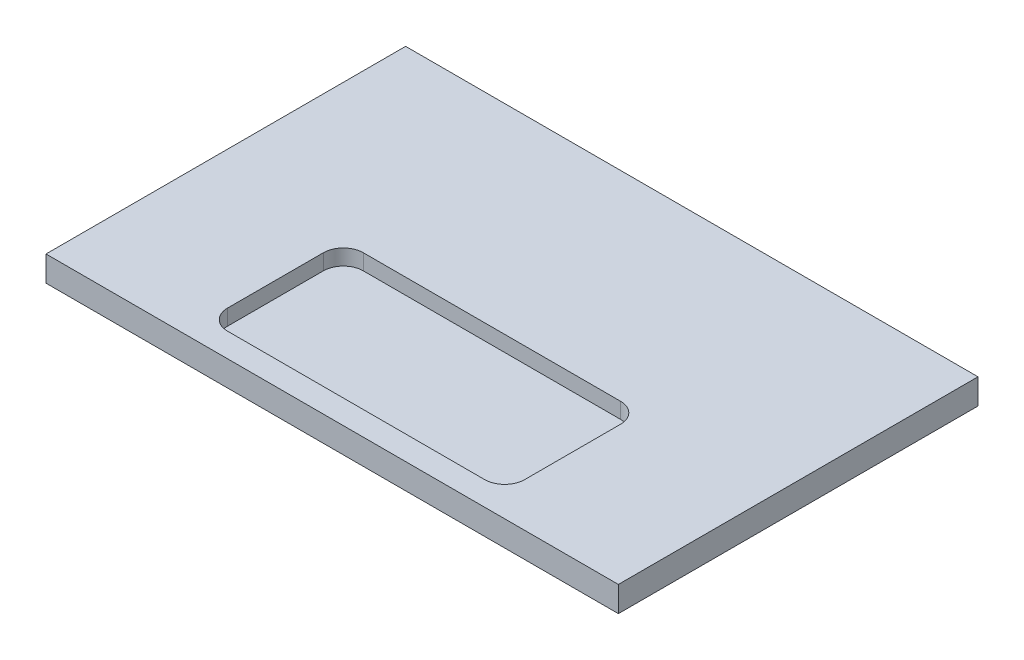
ISO-10303-21;
HEADER;
FILE_DESCRIPTION(('STEP AP214'),'2;1');
FILE_NAME('part.step','',(''),(''),'','','');
FILE_SCHEMA(('AUTOMOTIVE_DESIGN { 1 0 10303 214 1 1 1 1 }'));
ENDSEC;
DATA;
#1=APPLICATION_CONTEXT('core data for automotive mechanical design processes');
#2=APPLICATION_PROTOCOL_DEFINITION('international standard','automotive_design',2000,#1);
#3=PRODUCT_CONTEXT('',#1,'mechanical');
#4=PRODUCT('Part','Part','',(#3));
#5=PRODUCT_RELATED_PRODUCT_CATEGORY('part','',(#4));
#6=PRODUCT_DEFINITION_FORMATION('','',#4);
#7=PRODUCT_DEFINITION_CONTEXT('part definition',#1,'design');
#8=PRODUCT_DEFINITION('design','',#6,#7);
#9=PRODUCT_DEFINITION_SHAPE('','',#8);
#10=(LENGTH_UNIT() NAMED_UNIT(*) SI_UNIT(.MILLI.,.METRE.));
#11=(NAMED_UNIT(*) PLANE_ANGLE_UNIT() SI_UNIT($,.RADIAN.));
#12=(NAMED_UNIT(*) SI_UNIT($,.STERADIAN.) SOLID_ANGLE_UNIT());
#13=UNCERTAINTY_MEASURE_WITH_UNIT(LENGTH_MEASURE(1.E-05),#10,'distance_accuracy_value','');
#14=(GEOMETRIC_REPRESENTATION_CONTEXT(3) GLOBAL_UNCERTAINTY_ASSIGNED_CONTEXT((#13)) GLOBAL_UNIT_ASSIGNED_CONTEXT((#10,
#11,#12)) REPRESENTATION_CONTEXT('',''));
#15=CARTESIAN_POINT('',(0.,0.,0.));
#16=DIRECTION('',(0.,0.,1.));
#17=DIRECTION('',(1.,0.,0.));
#18=AXIS2_PLACEMENT_3D('',#15,#16,#17);
#19=CARTESIAN_POINT('',(-192.196752827141,12.7,168.516074313409));
#20=DIRECTION('',(1.,0.,0.));
#21=DIRECTION('',(0.,0.,-1.));
#22=AXIS2_PLACEMENT_3D('',#19,#20,#21);
#23=PLANE('',#22);
#24=DIRECTION('',(0.,0.,1.));
#25=VECTOR('',#24,1.);
#26=CARTESIAN_POINT('',(-192.196752827141,0.,168.516074313409));
#27=LINE('',#26,#25);
#28=CARTESIAN_POINT('',(-192.196752827141,0.,-11.8239256865913));
#29=VERTEX_POINT('',#28);
#30=CARTESIAN_POINT('',(-192.196752827141,0.,168.516074313409));
#31=VERTEX_POINT('',#30);
#32=EDGE_CURVE('E143',#29,#31,#27,.T.);
#33=ORIENTED_EDGE('',*,*,#32,.T.);
#34=DIRECTION('',(0.,-1.,0.));
#35=VECTOR('',#34,1.);
#36=CARTESIAN_POINT('',(-192.196752827141,12.7,168.516074313409));
#37=LINE('',#36,#35);
#38=CARTESIAN_POINT('',(-192.196752827141,12.7,168.516074313409));
#39=VERTEX_POINT('',#38);
#40=EDGE_CURVE('E124',#39,#31,#37,.T.);
#41=ORIENTED_EDGE('',*,*,#40,.F.);
#42=DIRECTION('',(0.,0.,1.));
#43=VECTOR('',#42,1.);
#44=CARTESIAN_POINT('',(-192.196752827141,12.7,168.516074313409));
#45=LINE('',#44,#43);
#46=CARTESIAN_POINT('',(-192.196752827141,12.7,-11.8239256865913));
#47=VERTEX_POINT('',#46);
#48=EDGE_CURVE('E131',#47,#39,#45,.T.);
#49=ORIENTED_EDGE('',*,*,#48,.F.);
#50=DIRECTION('',(0.,-1.,0.));
#51=VECTOR('',#50,1.);
#52=CARTESIAN_POINT('',(-192.196752827141,12.7,-11.8239256865913));
#53=LINE('',#52,#51);
#54=EDGE_CURVE('E222',#47,#29,#53,.T.);
#55=ORIENTED_EDGE('',*,*,#54,.T.);
#56=EDGE_LOOP('',(#33,#41,#49,#55));
#57=FACE_BOUND('',#56,.T.);
#58=ADVANCED_FACE('F32',(#57),#23,.F.);
#59=CARTESIAN_POINT('',(94.8232471728595,12.7,168.516074313409));
#60=DIRECTION('',(0.,0.,-1.));
#61=DIRECTION('',(-1.,0.,0.));
#62=AXIS2_PLACEMENT_3D('',#59,#60,#61);
#63=PLANE('',#62);
#64=DIRECTION('',(1.,0.,0.));
#65=VECTOR('',#64,1.);
#66=CARTESIAN_POINT('',(94.8232471728595,0.,168.516074313409));
#67=LINE('',#66,#65);
#68=CARTESIAN_POINT('',(94.8232471728595,0.,168.516074313409));
#69=VERTEX_POINT('',#68);
#70=EDGE_CURVE('E224',#31,#69,#67,.T.);
#71=ORIENTED_EDGE('',*,*,#70,.T.);
#72=DIRECTION('',(0.,-1.,0.));
#73=VECTOR('',#72,1.);
#74=CARTESIAN_POINT('',(94.8232471728595,12.7,168.516074313409));
#75=LINE('',#74,#73);
#76=CARTESIAN_POINT('',(94.8232471728595,12.7,168.516074313409));
#77=VERTEX_POINT('',#76);
#78=EDGE_CURVE('E127',#77,#69,#75,.T.);
#79=ORIENTED_EDGE('',*,*,#78,.F.);
#80=DIRECTION('',(1.,0.,0.));
#81=VECTOR('',#80,1.);
#82=CARTESIAN_POINT('',(94.8232471728595,12.7,168.516074313409));
#83=LINE('',#82,#81);
#84=EDGE_CURVE('E120',#39,#77,#83,.T.);
#85=ORIENTED_EDGE('',*,*,#84,.F.);
#86=ORIENTED_EDGE('',*,*,#40,.T.);
#87=EDGE_LOOP('',(#71,#79,#85,#86));
#88=FACE_BOUND('',#87,.T.);
#89=ADVANCED_FACE('F122',(#88),#63,.F.);
#90=CARTESIAN_POINT('',(94.8232471728595,12.7,-11.8239256865913));
#91=DIRECTION('',(-1.,0.,0.));
#92=DIRECTION('',(0.,0.,1.));
#93=AXIS2_PLACEMENT_3D('',#90,#91,#92);
#94=PLANE('',#93);
#95=DIRECTION('',(0.,0.,-1.));
#96=VECTOR('',#95,1.);
#97=CARTESIAN_POINT('',(94.8232471728595,0.,-11.8239256865913));
#98=LINE('',#97,#96);
#99=CARTESIAN_POINT('',(94.8232471728595,0.,-11.8239256865913));
#100=VERTEX_POINT('',#99);
#101=EDGE_CURVE('E226',#69,#100,#98,.T.);
#102=ORIENTED_EDGE('',*,*,#101,.T.);
#103=DIRECTION('',(0.,-1.,0.));
#104=VECTOR('',#103,1.);
#105=CARTESIAN_POINT('',(94.8232471728595,12.7,-11.8239256865913));
#106=LINE('',#105,#104);
#107=CARTESIAN_POINT('',(94.8232471728595,12.7,-11.8239256865913));
#108=VERTEX_POINT('',#107);
#109=EDGE_CURVE('E148',#108,#100,#106,.T.);
#110=ORIENTED_EDGE('',*,*,#109,.F.);
#111=DIRECTION('',(0.,0.,-1.));
#112=VECTOR('',#111,1.);
#113=CARTESIAN_POINT('',(94.8232471728595,12.7,-11.8239256865913));
#114=LINE('',#113,#112);
#115=EDGE_CURVE('E130',#77,#108,#114,.T.);
#116=ORIENTED_EDGE('',*,*,#115,.F.);
#117=ORIENTED_EDGE('',*,*,#78,.T.);
#118=EDGE_LOOP('',(#102,#110,#116,#117));
#119=FACE_BOUND('',#118,.T.);
#120=ADVANCED_FACE('F238',(#119),#94,.F.);
#121=CARTESIAN_POINT('',(-192.196752827141,12.7,-11.8239256865913));
#122=DIRECTION('',(0.,0.,1.));
#123=DIRECTION('',(1.,0.,0.));
#124=AXIS2_PLACEMENT_3D('',#121,#122,#123);
#125=PLANE('',#124);
#126=DIRECTION('',(-1.,0.,0.));
#127=VECTOR('',#126,1.);
#128=CARTESIAN_POINT('',(-192.196752827141,0.,-11.8239256865913));
#129=LINE('',#128,#127);
#130=EDGE_CURVE('E140',#100,#29,#129,.T.);
#131=ORIENTED_EDGE('',*,*,#130,.T.);
#132=ORIENTED_EDGE('',*,*,#54,.F.);
#133=DIRECTION('',(-1.,0.,0.));
#134=VECTOR('',#133,1.);
#135=CARTESIAN_POINT('',(-192.196752827141,12.7,-11.8239256865913));
#136=LINE('',#135,#134);
#137=EDGE_CURVE('E136',#108,#47,#136,.T.);
#138=ORIENTED_EDGE('',*,*,#137,.F.);
#139=ORIENTED_EDGE('',*,*,#109,.T.);
#140=EDGE_LOOP('',(#131,#132,#138,#139));
#141=FACE_BOUND('',#140,.T.);
#142=ADVANCED_FACE('F233',(#141),#125,.F.);
#143=CARTESIAN_POINT('',(0.,12.7,0.));
#144=DIRECTION('',(0.,-1.,0.));
#145=DIRECTION('',(0.,0.,-1.));
#146=AXIS2_PLACEMENT_3D('',#143,#144,#145);
#147=PLANE('',#146);
#148=DIRECTION('',(0.,0.,-1.));
#149=VECTOR('',#148,1.);
#150=CARTESIAN_POINT('',(25.8132471728595,12.7,88.4160743134087));
#151=LINE('',#150,#149);
#152=CARTESIAN_POINT('',(25.8132471728595,12.7,146.516074313409));
#153=VERTEX_POINT('',#152);
#154=CARTESIAN_POINT('',(25.8132471728595,12.7,98.4160743134087));
#155=VERTEX_POINT('',#154);
#156=EDGE_CURVE('E182',#153,#155,#151,.T.);
#157=ORIENTED_EDGE('',*,*,#156,.F.);
#158=CARTESIAN_POINT('',(15.8132471728595,12.7,146.516074313409));
#159=DIRECTION('',(0.,-1.,0.));
#160=DIRECTION('',(0.,0.,-1.));
#161=AXIS2_PLACEMENT_3D('',#158,#159,#160);
#162=CIRCLE('',#161,10.);
#163=CARTESIAN_POINT('',(15.8132471728595,12.7,156.516074313409));
#164=VERTEX_POINT('',#163);
#165=EDGE_CURVE('E176',#153,#164,#162,.T.);
#166=ORIENTED_EDGE('',*,*,#165,.T.);
#167=DIRECTION('',(1.,0.,0.));
#168=VECTOR('',#167,1.);
#169=CARTESIAN_POINT('',(25.8132471728595,12.7,156.516074313409));
#170=LINE('',#169,#168);
#171=CARTESIAN_POINT('',(-113.186752827141,12.7,156.516074313409));
#172=VERTEX_POINT('',#171);
#173=EDGE_CURVE('E193',#172,#164,#170,.T.);
#174=ORIENTED_EDGE('',*,*,#173,.F.);
#175=CARTESIAN_POINT('',(-113.186752827141,12.7,146.516074313409));
#176=DIRECTION('',(0.,-1.,0.));
#177=DIRECTION('',(0.,0.,-1.));
#178=AXIS2_PLACEMENT_3D('',#175,#176,#177);
#179=CIRCLE('',#178,10.);
#180=CARTESIAN_POINT('',(-123.186752827141,12.7,146.516074313409));
#181=VERTEX_POINT('',#180);
#182=EDGE_CURVE('E40',#172,#181,#179,.T.);
#183=ORIENTED_EDGE('',*,*,#182,.T.);
#184=DIRECTION('',(0.,0.,1.));
#185=VECTOR('',#184,1.);
#186=CARTESIAN_POINT('',(-123.186752827141,12.7,156.516074313409));
#187=LINE('',#186,#185);
#188=CARTESIAN_POINT('',(-123.186752827141,12.7,98.4160743134087));
#189=VERTEX_POINT('',#188);
#190=EDGE_CURVE('E218',#189,#181,#187,.T.);
#191=ORIENTED_EDGE('',*,*,#190,.F.);
#192=CARTESIAN_POINT('',(-113.186752827141,12.7,98.4160743134087));
#193=DIRECTION('',(0.,-1.,0.));
#194=DIRECTION('',(0.,0.,-1.));
#195=AXIS2_PLACEMENT_3D('',#192,#193,#194);
#196=CIRCLE('',#195,10.);
#197=CARTESIAN_POINT('',(-113.186752827141,12.7,88.4160743134088));
#198=VERTEX_POINT('',#197);
#199=EDGE_CURVE('E11',#189,#198,#196,.T.);
#200=ORIENTED_EDGE('',*,*,#199,.T.);
#201=DIRECTION('',(-1.,0.,0.));
#202=VECTOR('',#201,1.);
#203=CARTESIAN_POINT('',(-123.186752827141,12.7,88.4160743134088));
#204=LINE('',#203,#202);
#205=CARTESIAN_POINT('',(15.8132471728595,12.7,88.4160743134087));
#206=VERTEX_POINT('',#205);
#207=EDGE_CURVE('E184',#206,#198,#204,.T.);
#208=ORIENTED_EDGE('',*,*,#207,.F.);
#209=CARTESIAN_POINT('',(15.8132471728595,12.7,98.4160743134087));
#210=DIRECTION('',(0.,-1.,0.));
#211=DIRECTION('',(0.,0.,-1.));
#212=AXIS2_PLACEMENT_3D('',#209,#210,#211);
#213=CIRCLE('',#212,10.);
#214=EDGE_CURVE('E178',#206,#155,#213,.T.);
#215=ORIENTED_EDGE('',*,*,#214,.T.);
#216=EDGE_LOOP('',(#157,#166,#174,#183,#191,#200,#208,#215));
#217=FACE_BOUND('',#216,.T.);
#218=ORIENTED_EDGE('',*,*,#48,.T.);
#219=ORIENTED_EDGE('',*,*,#84,.T.);
#220=ORIENTED_EDGE('',*,*,#115,.T.);
#221=ORIENTED_EDGE('',*,*,#137,.T.);
#222=EDGE_LOOP('',(#218,#219,#220,#221));
#223=FACE_BOUND('',#222,.T.);
#224=ADVANCED_FACE('F134',(#217,#223),#147,.F.);
#225=CARTESIAN_POINT('',(0.,0.,0.));
#226=DIRECTION('',(0.,-1.,0.));
#227=DIRECTION('',(0.,0.,-1.));
#228=AXIS2_PLACEMENT_3D('',#225,#226,#227);
#229=PLANE('',#228);
#230=ORIENTED_EDGE('',*,*,#32,.F.);
#231=ORIENTED_EDGE('',*,*,#130,.F.);
#232=ORIENTED_EDGE('',*,*,#101,.F.);
#233=ORIENTED_EDGE('',*,*,#70,.F.);
#234=EDGE_LOOP('',(#230,#231,#232,#233));
#235=FACE_BOUND('',#234,.T.);
#236=ADVANCED_FACE('F237',(#235),#229,.T.);
#237=CARTESIAN_POINT('',(25.8132471728595,4.826,156.516074313409));
#238=DIRECTION('',(0.,0.,1.));
#239=DIRECTION('',(1.,0.,0.));
#240=AXIS2_PLACEMENT_3D('',#237,#238,#239);
#241=PLANE('',#240);
#242=ORIENTED_EDGE('',*,*,#173,.T.);
#243=DIRECTION('',(0.,1.,0.));
#244=VECTOR('',#243,1.);
#245=CARTESIAN_POINT('',(15.8132471728595,4.826,156.516074313409));
#246=LINE('',#245,#244);
#247=CARTESIAN_POINT('',(15.8132471728595,4.826,156.516074313409));
#248=VERTEX_POINT('',#247);
#249=EDGE_CURVE('E157',#164,#248,#246,.F.);
#250=ORIENTED_EDGE('',*,*,#249,.T.);
#251=DIRECTION('',(1.,0.,0.));
#252=VECTOR('',#251,1.);
#253=CARTESIAN_POINT('',(25.8132471728595,4.826,156.516074313409));
#254=LINE('',#253,#252);
#255=CARTESIAN_POINT('',(-113.186752827141,4.826,156.516074313409));
#256=VERTEX_POINT('',#255);
#257=EDGE_CURVE('E211',#256,#248,#254,.T.);
#258=ORIENTED_EDGE('',*,*,#257,.F.);
#259=DIRECTION('',(0.,1.,0.));
#260=VECTOR('',#259,1.);
#261=CARTESIAN_POINT('',(-113.186752827141,12.7,156.516074313409));
#262=LINE('',#261,#260);
#263=EDGE_CURVE('E154',#256,#172,#262,.T.);
#264=ORIENTED_EDGE('',*,*,#263,.T.);
#265=EDGE_LOOP('',(#242,#250,#258,#264));
#266=FACE_BOUND('',#265,.T.);
#267=ADVANCED_FACE('F270',(#266),#241,.F.);
#268=CARTESIAN_POINT('',(-123.186752827141,4.826,156.516074313409));
#269=DIRECTION('',(-1.,0.,0.));
#270=DIRECTION('',(0.,0.,1.));
#271=AXIS2_PLACEMENT_3D('',#268,#269,#270);
#272=PLANE('',#271);
#273=ORIENTED_EDGE('',*,*,#190,.T.);
#274=DIRECTION('',(0.,1.,0.));
#275=VECTOR('',#274,1.);
#276=CARTESIAN_POINT('',(-123.186752827141,4.826,146.516074313409));
#277=LINE('',#276,#275);
#278=CARTESIAN_POINT('',(-123.186752827141,4.826,146.516074313409));
#279=VERTEX_POINT('',#278);
#280=EDGE_CURVE('E174',#181,#279,#277,.F.);
#281=ORIENTED_EDGE('',*,*,#280,.T.);
#282=DIRECTION('',(0.,0.,1.));
#283=VECTOR('',#282,1.);
#284=CARTESIAN_POINT('',(-123.186752827141,4.826,156.516074313409));
#285=LINE('',#284,#283);
#286=CARTESIAN_POINT('',(-123.186752827141,4.826,98.4160743134087));
#287=VERTEX_POINT('',#286);
#288=EDGE_CURVE('E207',#287,#279,#285,.T.);
#289=ORIENTED_EDGE('',*,*,#288,.F.);
#290=DIRECTION('',(0.,1.,0.));
#291=VECTOR('',#290,1.);
#292=CARTESIAN_POINT('',(-123.186752827141,12.7,98.4160743134087));
#293=LINE('',#292,#291);
#294=EDGE_CURVE('E172',#287,#189,#293,.T.);
#295=ORIENTED_EDGE('',*,*,#294,.T.);
#296=EDGE_LOOP('',(#273,#281,#289,#295));
#297=FACE_BOUND('',#296,.T.);
#298=ADVANCED_FACE('F273',(#297),#272,.F.);
#299=CARTESIAN_POINT('',(-123.186752827141,4.826,88.4160743134088));
#300=DIRECTION('',(0.,0.,-1.));
#301=DIRECTION('',(-1.,0.,0.));
#302=AXIS2_PLACEMENT_3D('',#299,#300,#301);
#303=PLANE('',#302);
#304=DIRECTION('',(-1.,0.,0.));
#305=VECTOR('',#304,1.);
#306=CARTESIAN_POINT('',(-123.186752827141,4.826,88.4160743134088));
#307=LINE('',#306,#305);
#308=CARTESIAN_POINT('',(15.8132471728595,4.826,88.4160743134087));
#309=VERTEX_POINT('',#308);
#310=CARTESIAN_POINT('',(-113.186752827141,4.826,88.4160743134088));
#311=VERTEX_POINT('',#310);
#312=EDGE_CURVE('E202',#309,#311,#307,.T.);
#313=ORIENTED_EDGE('',*,*,#312,.F.);
#314=DIRECTION('',(0.,1.,0.));
#315=VECTOR('',#314,1.);
#316=CARTESIAN_POINT('',(15.8132471728595,12.7,88.4160743134087));
#317=LINE('',#316,#315);
#318=EDGE_CURVE('E169',#309,#206,#317,.T.);
#319=ORIENTED_EDGE('',*,*,#318,.T.);
#320=ORIENTED_EDGE('',*,*,#207,.T.);
#321=DIRECTION('',(0.,1.,0.));
#322=VECTOR('',#321,1.);
#323=CARTESIAN_POINT('',(-113.186752827141,4.826,88.4160743134088));
#324=LINE('',#323,#322);
#325=EDGE_CURVE('E167',#198,#311,#324,.F.);
#326=ORIENTED_EDGE('',*,*,#325,.T.);
#327=EDGE_LOOP('',(#313,#319,#320,#326));
#328=FACE_BOUND('',#327,.T.);
#329=ADVANCED_FACE('F206',(#328),#303,.F.);
#330=CARTESIAN_POINT('',(25.8132471728595,4.826,88.4160743134087));
#331=DIRECTION('',(1.,0.,0.));
#332=DIRECTION('',(0.,0.,-1.));
#333=AXIS2_PLACEMENT_3D('',#330,#331,#332);
#334=PLANE('',#333);
#335=DIRECTION('',(0.,0.,-1.));
#336=VECTOR('',#335,1.);
#337=CARTESIAN_POINT('',(25.8132471728595,4.826,88.4160743134087));
#338=LINE('',#337,#336);
#339=CARTESIAN_POINT('',(25.8132471728595,4.826,146.516074313409));
#340=VERTEX_POINT('',#339);
#341=CARTESIAN_POINT('',(25.8132471728595,4.826,98.4160743134087));
#342=VERTEX_POINT('',#341);
#343=EDGE_CURVE('E204',#340,#342,#338,.T.);
#344=ORIENTED_EDGE('',*,*,#343,.F.);
#345=DIRECTION('',(0.,1.,0.));
#346=VECTOR('',#345,1.);
#347=CARTESIAN_POINT('',(25.8132471728595,12.7,146.516074313409));
#348=LINE('',#347,#346);
#349=EDGE_CURVE('E146',#340,#153,#348,.T.);
#350=ORIENTED_EDGE('',*,*,#349,.T.);
#351=ORIENTED_EDGE('',*,*,#156,.T.);
#352=DIRECTION('',(0.,1.,0.));
#353=VECTOR('',#352,1.);
#354=CARTESIAN_POINT('',(25.8132471728595,4.826,98.4160743134087));
#355=LINE('',#354,#353);
#356=EDGE_CURVE('E144',#155,#342,#355,.F.);
#357=ORIENTED_EDGE('',*,*,#356,.T.);
#358=EDGE_LOOP('',(#344,#350,#351,#357));
#359=FACE_BOUND('',#358,.T.);
#360=ADVANCED_FACE('F190',(#359),#334,.F.);
#361=CARTESIAN_POINT('',(0.,4.826,0.));
#362=DIRECTION('',(0.,-1.,0.));
#363=DIRECTION('',(0.,0.,-1.));
#364=AXIS2_PLACEMENT_3D('',#361,#362,#363);
#365=PLANE('',#364);
#366=ORIENTED_EDGE('',*,*,#257,.T.);
#367=CARTESIAN_POINT('',(15.8132471728595,4.826,146.516074313409));
#368=DIRECTION('',(0.,-1.,0.));
#369=DIRECTION('',(0.,0.,-1.));
#370=AXIS2_PLACEMENT_3D('',#367,#368,#369);
#371=CIRCLE('',#370,10.);
#372=EDGE_CURVE('E165',#248,#340,#371,.F.);
#373=ORIENTED_EDGE('',*,*,#372,.T.);
#374=ORIENTED_EDGE('',*,*,#343,.T.);
#375=CARTESIAN_POINT('',(15.8132471728595,4.826,98.4160743134087));
#376=DIRECTION('',(0.,-1.,0.));
#377=DIRECTION('',(0.,0.,-1.));
#378=AXIS2_PLACEMENT_3D('',#375,#376,#377);
#379=CIRCLE('',#378,10.);
#380=EDGE_CURVE('E163',#342,#309,#379,.F.);
#381=ORIENTED_EDGE('',*,*,#380,.T.);
#382=ORIENTED_EDGE('',*,*,#312,.T.);
#383=CARTESIAN_POINT('',(-113.186752827141,4.826,98.4160743134087));
#384=DIRECTION('',(0.,-1.,0.));
#385=DIRECTION('',(0.,0.,-1.));
#386=AXIS2_PLACEMENT_3D('',#383,#384,#385);
#387=CIRCLE('',#386,10.);
#388=EDGE_CURVE('E159',#311,#287,#387,.F.);
#389=ORIENTED_EDGE('',*,*,#388,.T.);
#390=ORIENTED_EDGE('',*,*,#288,.T.);
#391=CARTESIAN_POINT('',(-113.186752827141,4.826,146.516074313409));
#392=DIRECTION('',(0.,-1.,0.));
#393=DIRECTION('',(0.,0.,-1.));
#394=AXIS2_PLACEMENT_3D('',#391,#392,#393);
#395=CIRCLE('',#394,10.);
#396=EDGE_CURVE('E161',#279,#256,#395,.F.);
#397=ORIENTED_EDGE('',*,*,#396,.T.);
#398=EDGE_LOOP('',(#366,#373,#374,#381,#382,#389,#390,#397));
#399=FACE_BOUND('',#398,.T.);
#400=ADVANCED_FACE('F201',(#399),#365,.F.);
#401=CARTESIAN_POINT('',(15.8132471728595,4.826,146.516074313409));
#402=DIRECTION('',(0.,-1.,0.));
#403=DIRECTION('',(0.,0.,-1.));
#404=AXIS2_PLACEMENT_3D('',#401,#402,#403);
#405=CYLINDRICAL_SURFACE('',#404,10.);
#406=ORIENTED_EDGE('',*,*,#372,.F.);
#407=ORIENTED_EDGE('',*,*,#249,.F.);
#408=ORIENTED_EDGE('',*,*,#165,.F.);
#409=ORIENTED_EDGE('',*,*,#349,.F.);
#410=EDGE_LOOP('',(#406,#407,#408,#409));
#411=FACE_BOUND('',#410,.T.);
#412=ADVANCED_FACE('F252',(#411),#405,.F.);
#413=CARTESIAN_POINT('',(15.8132471728595,4.826,98.4160743134087));
#414=DIRECTION('',(0.,-1.,0.));
#415=DIRECTION('',(0.,0.,-1.));
#416=AXIS2_PLACEMENT_3D('',#413,#414,#415);
#417=CYLINDRICAL_SURFACE('',#416,10.);
#418=ORIENTED_EDGE('',*,*,#380,.F.);
#419=ORIENTED_EDGE('',*,*,#356,.F.);
#420=ORIENTED_EDGE('',*,*,#214,.F.);
#421=ORIENTED_EDGE('',*,*,#318,.F.);
#422=EDGE_LOOP('',(#418,#419,#420,#421));
#423=FACE_BOUND('',#422,.T.);
#424=ADVANCED_FACE('F196',(#423),#417,.F.);
#425=CARTESIAN_POINT('',(-113.186752827141,4.826,146.516074313409));
#426=DIRECTION('',(0.,-1.,0.));
#427=DIRECTION('',(0.,0.,-1.));
#428=AXIS2_PLACEMENT_3D('',#425,#426,#427);
#429=CYLINDRICAL_SURFACE('',#428,10.);
#430=ORIENTED_EDGE('',*,*,#396,.F.);
#431=ORIENTED_EDGE('',*,*,#280,.F.);
#432=ORIENTED_EDGE('',*,*,#182,.F.);
#433=ORIENTED_EDGE('',*,*,#263,.F.);
#434=EDGE_LOOP('',(#430,#431,#432,#433));
#435=FACE_BOUND('',#434,.T.);
#436=ADVANCED_FACE('F257',(#435),#429,.F.);
#437=CARTESIAN_POINT('',(-113.186752827141,4.826,98.4160743134087));
#438=DIRECTION('',(0.,-1.,0.));
#439=DIRECTION('',(0.,0.,-1.));
#440=AXIS2_PLACEMENT_3D('',#437,#438,#439);
#441=CYLINDRICAL_SURFACE('',#440,10.);
#442=ORIENTED_EDGE('',*,*,#388,.F.);
#443=ORIENTED_EDGE('',*,*,#325,.F.);
#444=ORIENTED_EDGE('',*,*,#199,.F.);
#445=ORIENTED_EDGE('',*,*,#294,.F.);
#446=EDGE_LOOP('',(#442,#443,#444,#445));
#447=FACE_BOUND('',#446,.T.);
#448=ADVANCED_FACE('F34',(#447),#441,.F.);
#449=CLOSED_SHELL('',(#58,#89,#120,#142,#224,#236,#267,#298,#329,#360,#400,#412,#424,#436,#448));
#450=MANIFOLD_SOLID_BREP('B2',#449);
#451=ADVANCED_BREP_SHAPE_REPRESENTATION('',(#18,#450),#14);
#452=SHAPE_DEFINITION_REPRESENTATION(#9,#451);
ENDSEC;
END-ISO-10303-21;
